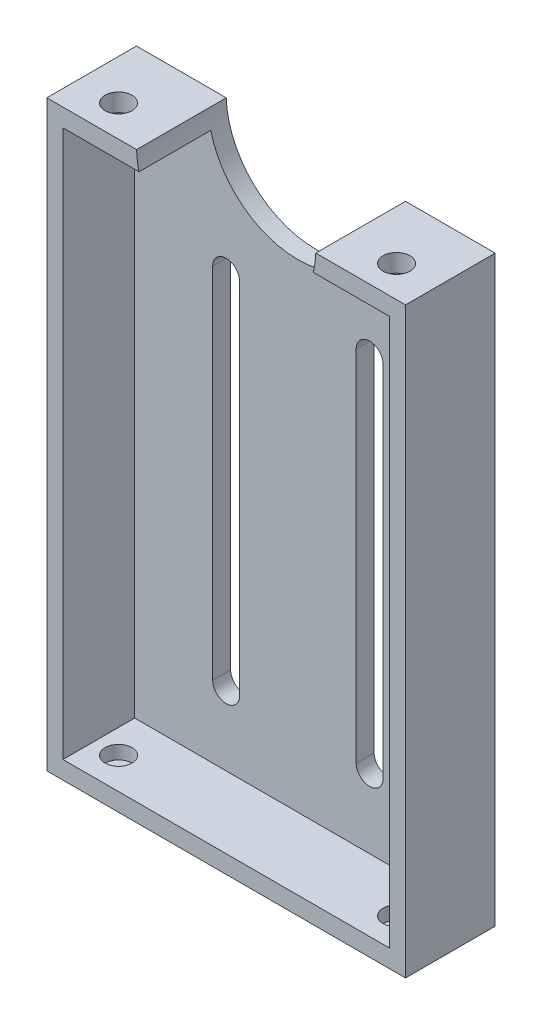
ISO-10303-21;
HEADER;
FILE_DESCRIPTION(('STEP AP214'),'2;1');
FILE_NAME('part.step','',(''),(''),'','','');
FILE_SCHEMA(('AUTOMOTIVE_DESIGN { 1 0 10303 214 1 1 1 1 }'));
ENDSEC;
DATA;
#1=APPLICATION_CONTEXT('core data for automotive mechanical design processes');
#2=APPLICATION_PROTOCOL_DEFINITION('international standard','automotive_design',2000,#1);
#3=PRODUCT_CONTEXT('',#1,'mechanical');
#4=PRODUCT('Part','Part','',(#3));
#5=PRODUCT_RELATED_PRODUCT_CATEGORY('part','',(#4));
#6=PRODUCT_DEFINITION_FORMATION('','',#4);
#7=PRODUCT_DEFINITION_CONTEXT('part definition',#1,'design');
#8=PRODUCT_DEFINITION('design','',#6,#7);
#9=PRODUCT_DEFINITION_SHAPE('','',#8);
#10=(LENGTH_UNIT() NAMED_UNIT(*) SI_UNIT(.MILLI.,.METRE.));
#11=(NAMED_UNIT(*) PLANE_ANGLE_UNIT() SI_UNIT($,.RADIAN.));
#12=(NAMED_UNIT(*) SI_UNIT($,.STERADIAN.) SOLID_ANGLE_UNIT());
#13=UNCERTAINTY_MEASURE_WITH_UNIT(LENGTH_MEASURE(1.E-05),#10,'distance_accuracy_value','');
#14=(GEOMETRIC_REPRESENTATION_CONTEXT(3) GLOBAL_UNCERTAINTY_ASSIGNED_CONTEXT((#13)) GLOBAL_UNIT_ASSIGNED_CONTEXT((#10,
#11,#12)) REPRESENTATION_CONTEXT('',''));
#15=CARTESIAN_POINT('',(0.,0.,0.));
#16=DIRECTION('',(0.,0.,1.));
#17=DIRECTION('',(1.,0.,0.));
#18=AXIS2_PLACEMENT_3D('',#15,#16,#17);
#19=CARTESIAN_POINT('',(0.,32.8692474088532,2.));
#20=DIRECTION('',(0.,0.,1.));
#21=DIRECTION('',(1.,0.,0.));
#22=AXIS2_PLACEMENT_3D('',#19,#20,#21);
#23=PLANE('',#22);
#24=DIRECTION('',(1.,0.,0.));
#25=VECTOR('',#24,1.);
#26=CARTESIAN_POINT('',(-18.2,30.5,2.));
#27=LINE('',#26,#25);
#28=CARTESIAN_POINT('',(-18.2,30.5,2.));
#29=VERTEX_POINT('',#28);
#30=CARTESIAN_POINT('',(-9.71528006367509,30.5,2.));
#31=VERTEX_POINT('',#30);
#32=EDGE_CURVE('E48',#29,#31,#27,.T.);
#33=ORIENTED_EDGE('',*,*,#32,.F.);
#34=DIRECTION('',(0.,1.,0.));
#35=VECTOR('',#34,1.);
#36=CARTESIAN_POINT('',(-18.2,30.5,2.));
#37=LINE('',#36,#35);
#38=CARTESIAN_POINT('',(-18.2,-30.5,2.));
#39=VERTEX_POINT('',#38);
#40=EDGE_CURVE('E52',#39,#29,#37,.T.);
#41=ORIENTED_EDGE('',*,*,#40,.F.);
#42=DIRECTION('',(-1.,0.,0.));
#43=VECTOR('',#42,1.);
#44=CARTESIAN_POINT('',(-18.2,-30.5,2.));
#45=LINE('',#44,#43);
#46=CARTESIAN_POINT('',(18.2,-30.5,2.));
#47=VERTEX_POINT('',#46);
#48=EDGE_CURVE('E225',#47,#39,#45,.T.);
#49=ORIENTED_EDGE('',*,*,#48,.F.);
#50=DIRECTION('',(0.,-1.,0.));
#51=VECTOR('',#50,1.);
#52=CARTESIAN_POINT('',(18.2,30.5,2.));
#53=LINE('',#52,#51);
#54=CARTESIAN_POINT('',(18.2,30.5,2.));
#55=VERTEX_POINT('',#54);
#56=EDGE_CURVE('E221',#55,#47,#53,.T.);
#57=ORIENTED_EDGE('',*,*,#56,.F.);
#58=DIRECTION('',(1.,0.,0.));
#59=VECTOR('',#58,1.);
#60=CARTESIAN_POINT('',(18.2,30.5,2.));
#61=LINE('',#60,#59);
#62=CARTESIAN_POINT('',(9.71528006367509,30.5,2.));
#63=VERTEX_POINT('',#62);
#64=EDGE_CURVE('E218',#63,#55,#61,.T.);
#65=ORIENTED_EDGE('',*,*,#64,.F.);
#66=CARTESIAN_POINT('',(0.,32.8692474088532,2.));
#67=DIRECTION('',(0.,0.,-1.));
#68=DIRECTION('',(1.,0.,0.));
#69=AXIS2_PLACEMENT_3D('',#66,#67,#68);
#70=CIRCLE('',#69,10.);
#71=EDGE_CURVE('E309',#63,#31,#70,.T.);
#72=ORIENTED_EDGE('',*,*,#71,.T.);
#73=EDGE_LOOP('',(#33,#41,#49,#57,#65,#72));
#74=FACE_BOUND('',#73,.T.);
#75=DIRECTION('',(0.,-1.,0.));
#76=VECTOR('',#75,1.);
#77=CARTESIAN_POINT('',(-9.49999999999999,17.5,2.));
#78=LINE('',#77,#76);
#79=CARTESIAN_POINT('',(-9.49999999999999,17.5,2.));
#80=VERTEX_POINT('',#79);
#81=CARTESIAN_POINT('',(-9.49999999999999,-22.5,2.));
#82=VERTEX_POINT('',#81);
#83=EDGE_CURVE('E280',#80,#82,#78,.T.);
#84=ORIENTED_EDGE('',*,*,#83,.F.);
#85=CARTESIAN_POINT('',(-8.00000000000001,17.5,2.));
#86=DIRECTION('',(0.,0.,1.));
#87=DIRECTION('',(1.,0.,0.));
#88=AXIS2_PLACEMENT_3D('',#85,#86,#87);
#89=CIRCLE('',#88,1.49999999999999);
#90=CARTESIAN_POINT('',(-6.50000000000001,17.5,2.));
#91=VERTEX_POINT('',#90);
#92=EDGE_CURVE('E278',#91,#80,#89,.T.);
#93=ORIENTED_EDGE('',*,*,#92,.F.);
#94=DIRECTION('',(0.,1.,0.));
#95=VECTOR('',#94,1.);
#96=CARTESIAN_POINT('',(-6.50000000000001,17.5,2.));
#97=LINE('',#96,#95);
#98=CARTESIAN_POINT('',(-6.49999999999999,-22.5,2.));
#99=VERTEX_POINT('',#98);
#100=EDGE_CURVE('E286',#99,#91,#97,.T.);
#101=ORIENTED_EDGE('',*,*,#100,.F.);
#102=CARTESIAN_POINT('',(-7.99999999999999,-22.5,2.));
#103=DIRECTION('',(0.,0.,1.));
#104=DIRECTION('',(1.,0.,0.));
#105=AXIS2_PLACEMENT_3D('',#102,#103,#104);
#106=CIRCLE('',#105,1.49999999999999);
#107=EDGE_CURVE('E283',#82,#99,#106,.T.);
#108=ORIENTED_EDGE('',*,*,#107,.F.);
#109=EDGE_LOOP('',(#84,#93,#101,#108));
#110=FACE_BOUND('',#109,.T.);
#111=DIRECTION('',(0.,-1.,0.));
#112=VECTOR('',#111,1.);
#113=CARTESIAN_POINT('',(6.50000000000001,17.5,2.));
#114=LINE('',#113,#112);
#115=CARTESIAN_POINT('',(6.50000000000001,17.5,2.));
#116=VERTEX_POINT('',#115);
#117=CARTESIAN_POINT('',(6.50000000000002,-22.5,2.));
#118=VERTEX_POINT('',#117);
#119=EDGE_CURVE('E249',#116,#118,#114,.T.);
#120=ORIENTED_EDGE('',*,*,#119,.F.);
#121=CARTESIAN_POINT('',(8.00000000000001,17.5,2.));
#122=DIRECTION('',(0.,0.,1.));
#123=DIRECTION('',(-1.,0.,0.));
#124=AXIS2_PLACEMENT_3D('',#121,#122,#123);
#125=CIRCLE('',#124,1.49999999999999);
#126=CARTESIAN_POINT('',(9.49999999999998,17.5,2.));
#127=VERTEX_POINT('',#126);
#128=EDGE_CURVE('E247',#127,#116,#125,.T.);
#129=ORIENTED_EDGE('',*,*,#128,.F.);
#130=DIRECTION('',(0.,1.,0.));
#131=VECTOR('',#130,1.);
#132=CARTESIAN_POINT('',(9.49999999999998,17.5,2.));
#133=LINE('',#132,#131);
#134=CARTESIAN_POINT('',(9.49999999999999,-22.5,2.));
#135=VERTEX_POINT('',#134);
#136=EDGE_CURVE('E255',#135,#127,#133,.T.);
#137=ORIENTED_EDGE('',*,*,#136,.F.);
#138=CARTESIAN_POINT('',(8.00000000000002,-22.5,2.));
#139=DIRECTION('',(0.,0.,1.));
#140=DIRECTION('',(-1.,0.,0.));
#141=AXIS2_PLACEMENT_3D('',#138,#139,#140);
#142=CIRCLE('',#141,1.49999999999999);
#143=EDGE_CURVE('E252',#118,#135,#142,.T.);
#144=ORIENTED_EDGE('',*,*,#143,.F.);
#145=EDGE_LOOP('',(#120,#129,#137,#144));
#146=FACE_BOUND('',#145,.T.);
#147=ADVANCED_FACE('F33',(#74,#110,#146),#23,.T.);
#148=CARTESIAN_POINT('',(0.,32.8692474088532,0.));
#149=DIRECTION('',(0.,0.,1.));
#150=DIRECTION('',(1.,0.,0.));
#151=AXIS2_PLACEMENT_3D('',#148,#149,#150);
#152=PLANE('',#151);
#153=CARTESIAN_POINT('',(-8.00000000000001,17.5,0.));
#154=DIRECTION('',(0.,0.,1.));
#155=DIRECTION('',(1.,0.,0.));
#156=AXIS2_PLACEMENT_3D('',#153,#154,#155);
#157=CIRCLE('',#156,1.49999999999999);
#158=CARTESIAN_POINT('',(-6.50000000000001,17.5,0.));
#159=VERTEX_POINT('',#158);
#160=CARTESIAN_POINT('',(-9.49999999999999,17.5,0.));
#161=VERTEX_POINT('',#160);
#162=EDGE_CURVE('E277',#159,#161,#157,.T.);
#163=ORIENTED_EDGE('',*,*,#162,.T.);
#164=DIRECTION('',(0.,-1.,0.));
#165=VECTOR('',#164,1.);
#166=CARTESIAN_POINT('',(-9.49999999999999,17.5,0.));
#167=LINE('',#166,#165);
#168=CARTESIAN_POINT('',(-9.49999999999999,-22.5,0.));
#169=VERTEX_POINT('',#168);
#170=EDGE_CURVE('E291',#161,#169,#167,.T.);
#171=ORIENTED_EDGE('',*,*,#170,.T.);
#172=CARTESIAN_POINT('',(-7.99999999999999,-22.5,0.));
#173=DIRECTION('',(0.,0.,1.));
#174=DIRECTION('',(1.,0.,0.));
#175=AXIS2_PLACEMENT_3D('',#172,#173,#174);
#176=CIRCLE('',#175,1.49999999999999);
#177=CARTESIAN_POINT('',(-6.49999999999999,-22.5,0.));
#178=VERTEX_POINT('',#177);
#179=EDGE_CURVE('E294',#169,#178,#176,.T.);
#180=ORIENTED_EDGE('',*,*,#179,.T.);
#181=DIRECTION('',(0.,1.,0.));
#182=VECTOR('',#181,1.);
#183=CARTESIAN_POINT('',(-6.50000000000001,17.5,0.));
#184=LINE('',#183,#182);
#185=EDGE_CURVE('E281',#178,#159,#184,.T.);
#186=ORIENTED_EDGE('',*,*,#185,.T.);
#187=EDGE_LOOP('',(#163,#171,#180,#186));
#188=FACE_BOUND('',#187,.T.);
#189=DIRECTION('',(0.,1.,0.));
#190=VECTOR('',#189,1.);
#191=CARTESIAN_POINT('',(20.,32.5,0.));
#192=LINE('',#191,#190);
#193=CARTESIAN_POINT('',(20.,-32.5,0.));
#194=VERTEX_POINT('',#193);
#195=CARTESIAN_POINT('',(20.,32.5,0.));
#196=VERTEX_POINT('',#195);
#197=EDGE_CURVE('E308',#194,#196,#192,.T.);
#198=ORIENTED_EDGE('',*,*,#197,.F.);
#199=DIRECTION('',(1.,0.,0.));
#200=VECTOR('',#199,1.);
#201=CARTESIAN_POINT('',(-20.,-32.5,0.));
#202=LINE('',#201,#200);
#203=CARTESIAN_POINT('',(-20.,-32.5,0.));
#204=VERTEX_POINT('',#203);
#205=EDGE_CURVE('E311',#204,#194,#202,.T.);
#206=ORIENTED_EDGE('',*,*,#205,.F.);
#207=DIRECTION('',(0.,-1.,0.));
#208=VECTOR('',#207,1.);
#209=CARTESIAN_POINT('',(-20.,32.5,0.));
#210=LINE('',#209,#208);
#211=CARTESIAN_POINT('',(-20.,32.5,0.));
#212=VERTEX_POINT('',#211);
#213=EDGE_CURVE('E174',#212,#204,#210,.T.);
#214=ORIENTED_EDGE('',*,*,#213,.F.);
#215=DIRECTION('',(-1.,0.,0.));
#216=VECTOR('',#215,1.);
#217=CARTESIAN_POINT('',(-20.,32.5,0.));
#218=LINE('',#217,#216);
#219=CARTESIAN_POINT('',(-9.99318049226848,32.5,0.));
#220=VERTEX_POINT('',#219);
#221=EDGE_CURVE('E318',#220,#212,#218,.T.);
#222=ORIENTED_EDGE('',*,*,#221,.F.);
#223=CARTESIAN_POINT('',(0.,32.8692474088532,0.));
#224=DIRECTION('',(0.,0.,-1.));
#225=DIRECTION('',(1.,0.,0.));
#226=AXIS2_PLACEMENT_3D('',#223,#224,#225);
#227=CIRCLE('',#226,10.);
#228=CARTESIAN_POINT('',(9.99318049226848,32.5,0.));
#229=VERTEX_POINT('',#228);
#230=EDGE_CURVE('E316',#229,#220,#227,.T.);
#231=ORIENTED_EDGE('',*,*,#230,.F.);
#232=DIRECTION('',(-1.,0.,0.));
#233=VECTOR('',#232,1.);
#234=CARTESIAN_POINT('',(9.99318049226848,32.5,0.));
#235=LINE('',#234,#233);
#236=EDGE_CURVE('E314',#196,#229,#235,.T.);
#237=ORIENTED_EDGE('',*,*,#236,.F.);
#238=EDGE_LOOP('',(#198,#206,#214,#222,#231,#237));
#239=FACE_BOUND('',#238,.T.);
#240=CARTESIAN_POINT('',(8.00000000000001,17.5,0.));
#241=DIRECTION('',(0.,0.,1.));
#242=DIRECTION('',(-1.,0.,0.));
#243=AXIS2_PLACEMENT_3D('',#240,#241,#242);
#244=CIRCLE('',#243,1.49999999999999);
#245=CARTESIAN_POINT('',(9.49999999999998,17.5,0.));
#246=VERTEX_POINT('',#245);
#247=CARTESIAN_POINT('',(6.50000000000001,17.5,0.));
#248=VERTEX_POINT('',#247);
#249=EDGE_CURVE('E246',#246,#248,#244,.T.);
#250=ORIENTED_EDGE('',*,*,#249,.T.);
#251=DIRECTION('',(0.,-1.,0.));
#252=VECTOR('',#251,1.);
#253=CARTESIAN_POINT('',(6.50000000000001,17.5,0.));
#254=LINE('',#253,#252);
#255=CARTESIAN_POINT('',(6.50000000000002,-22.5,0.));
#256=VERTEX_POINT('',#255);
#257=EDGE_CURVE('E260',#248,#256,#254,.T.);
#258=ORIENTED_EDGE('',*,*,#257,.T.);
#259=CARTESIAN_POINT('',(8.00000000000002,-22.5,0.));
#260=DIRECTION('',(0.,0.,1.));
#261=DIRECTION('',(-1.,0.,0.));
#262=AXIS2_PLACEMENT_3D('',#259,#260,#261);
#263=CIRCLE('',#262,1.49999999999999);
#264=CARTESIAN_POINT('',(9.50000000000001,-22.5,0.));
#265=VERTEX_POINT('',#264);
#266=EDGE_CURVE('E263',#256,#265,#263,.T.);
#267=ORIENTED_EDGE('',*,*,#266,.T.);
#268=DIRECTION('',(0.,1.,0.));
#269=VECTOR('',#268,1.);
#270=CARTESIAN_POINT('',(9.49999999999998,17.5,0.));
#271=LINE('',#270,#269);
#272=EDGE_CURVE('E250',#265,#246,#271,.T.);
#273=ORIENTED_EDGE('',*,*,#272,.T.);
#274=EDGE_LOOP('',(#250,#258,#267,#273));
#275=FACE_BOUND('',#274,.T.);
#276=ADVANCED_FACE('F337',(#188,#239,#275),#152,.F.);
#277=CARTESIAN_POINT('',(20.,32.5,2.));
#278=DIRECTION('',(-1.,0.,0.));
#279=DIRECTION('',(0.,-1.,0.));
#280=AXIS2_PLACEMENT_3D('',#277,#278,#279);
#281=PLANE('',#280);
#282=ORIENTED_EDGE('',*,*,#197,.T.);
#283=DIRECTION('',(0.,0.,-1.));
#284=VECTOR('',#283,1.);
#285=CARTESIAN_POINT('',(20.,32.5,2.));
#286=LINE('',#285,#284);
#287=CARTESIAN_POINT('',(20.,32.5,10.));
#288=VERTEX_POINT('',#287);
#289=EDGE_CURVE('E11',#288,#196,#286,.T.);
#290=ORIENTED_EDGE('',*,*,#289,.F.);
#291=DIRECTION('',(0.,1.,0.));
#292=VECTOR('',#291,1.);
#293=CARTESIAN_POINT('',(20.,-32.5,10.));
#294=LINE('',#293,#292);
#295=CARTESIAN_POINT('',(20.,-32.5,10.));
#296=VERTEX_POINT('',#295);
#297=EDGE_CURVE('E194',#296,#288,#294,.T.);
#298=ORIENTED_EDGE('',*,*,#297,.F.);
#299=DIRECTION('',(0.,0.,-1.));
#300=VECTOR('',#299,1.);
#301=CARTESIAN_POINT('',(20.,-32.5,2.));
#302=LINE('',#301,#300);
#303=EDGE_CURVE('E179',#296,#194,#302,.T.);
#304=ORIENTED_EDGE('',*,*,#303,.T.);
#305=EDGE_LOOP('',(#282,#290,#298,#304));
#306=FACE_BOUND('',#305,.T.);
#307=ADVANCED_FACE('F35',(#306),#281,.F.);
#308=CARTESIAN_POINT('',(9.99318049226848,32.5,2.));
#309=DIRECTION('',(0.,-1.,0.));
#310=DIRECTION('',(0.,0.,-1.));
#311=AXIS2_PLACEMENT_3D('',#308,#309,#310);
#312=PLANE('',#311);
#313=CARTESIAN_POINT('',(15.5,32.5,6.5));
#314=DIRECTION('',(0.,1.,0.));
#315=DIRECTION('',(0.,0.,-1.));
#316=AXIS2_PLACEMENT_3D('',#313,#314,#315);
#317=CIRCLE('',#316,1.5);
#318=CARTESIAN_POINT('',(15.5,32.5,5.));
#319=VERTEX_POINT('',#318);
#320=EDGE_CURVE('E661',#319,#319,#317,.T.);
#321=ORIENTED_EDGE('',*,*,#320,.F.);
#322=EDGE_LOOP('',(#321));
#323=FACE_BOUND('',#322,.T.);
#324=ORIENTED_EDGE('',*,*,#236,.T.);
#325=DIRECTION('',(0.,0.,-1.));
#326=VECTOR('',#325,1.);
#327=CARTESIAN_POINT('',(9.99318049226848,32.5,2.));
#328=LINE('',#327,#326);
#329=CARTESIAN_POINT('',(9.99318049226848,32.5,10.));
#330=VERTEX_POINT('',#329);
#331=EDGE_CURVE('E41',#330,#229,#328,.T.);
#332=ORIENTED_EDGE('',*,*,#331,.F.);
#333=DIRECTION('',(-1.,0.,0.));
#334=VECTOR('',#333,1.);
#335=CARTESIAN_POINT('',(20.,32.5,10.));
#336=LINE('',#335,#334);
#337=EDGE_CURVE('E196',#288,#330,#336,.T.);
#338=ORIENTED_EDGE('',*,*,#337,.F.);
#339=ORIENTED_EDGE('',*,*,#289,.T.);
#340=EDGE_LOOP('',(#324,#332,#338,#339));
#341=FACE_BOUND('',#340,.T.);
#342=ADVANCED_FACE('F355',(#323,#341),#312,.F.);
#343=CARTESIAN_POINT('',(0.,32.8692474088532,2.));
#344=DIRECTION('',(0.,0.,-1.));
#345=DIRECTION('',(-1.,0.,0.));
#346=AXIS2_PLACEMENT_3D('',#343,#344,#345);
#347=CYLINDRICAL_SURFACE('',#346,10.);
#348=ORIENTED_EDGE('',*,*,#230,.T.);
#349=DIRECTION('',(0.,0.,-1.));
#350=VECTOR('',#349,1.);
#351=CARTESIAN_POINT('',(-9.99318049226848,32.5,2.));
#352=LINE('',#351,#350);
#353=CARTESIAN_POINT('',(-9.99318049226848,32.5,10.));
#354=VERTEX_POINT('',#353);
#355=EDGE_CURVE('E324',#354,#220,#352,.T.);
#356=ORIENTED_EDGE('',*,*,#355,.F.);
#357=CARTESIAN_POINT('',(0.,32.8692474088532,10.));
#358=DIRECTION('',(0.,0.,-1.));
#359=DIRECTION('',(1.,0.,0.));
#360=AXIS2_PLACEMENT_3D('',#357,#358,#359);
#361=CIRCLE('',#360,10.);
#362=CARTESIAN_POINT('',(-9.71528006367509,30.5,10.));
#363=VERTEX_POINT('',#362);
#364=EDGE_CURVE('E214',#363,#354,#361,.T.);
#365=ORIENTED_EDGE('',*,*,#364,.F.);
#366=DIRECTION('',(0.,0.,-1.));
#367=VECTOR('',#366,1.);
#368=CARTESIAN_POINT('',(-9.71528006367509,30.5,10.));
#369=LINE('',#368,#367);
#370=EDGE_CURVE('E217',#363,#31,#369,.T.);
#371=ORIENTED_EDGE('',*,*,#370,.T.);
#372=ORIENTED_EDGE('',*,*,#71,.F.);
#373=DIRECTION('',(0.,0.,-1.));
#374=VECTOR('',#373,1.);
#375=CARTESIAN_POINT('',(9.71528006367509,30.5,10.));
#376=LINE('',#375,#374);
#377=CARTESIAN_POINT('',(9.71528006367509,30.5,10.));
#378=VERTEX_POINT('',#377);
#379=EDGE_CURVE('E243',#378,#63,#376,.T.);
#380=ORIENTED_EDGE('',*,*,#379,.F.);
#381=CARTESIAN_POINT('',(0.,32.8692474088532,10.));
#382=DIRECTION('',(0.,0.,-1.));
#383=DIRECTION('',(-1.,0.,0.));
#384=AXIS2_PLACEMENT_3D('',#381,#382,#383);
#385=CIRCLE('',#384,10.);
#386=EDGE_CURVE('E202',#330,#378,#385,.T.);
#387=ORIENTED_EDGE('',*,*,#386,.F.);
#388=ORIENTED_EDGE('',*,*,#331,.T.);
#389=EDGE_LOOP('',(#348,#356,#365,#371,#372,#380,#387,#388));
#390=FACE_BOUND('',#389,.T.);
#391=ADVANCED_FACE('F330',(#390),#347,.F.);
#392=CARTESIAN_POINT('',(-20.,32.5,2.));
#393=DIRECTION('',(0.,-1.,0.));
#394=DIRECTION('',(0.,0.,-1.));
#395=AXIS2_PLACEMENT_3D('',#392,#393,#394);
#396=PLANE('',#395);
#397=CARTESIAN_POINT('',(-15.5,32.5,6.5));
#398=DIRECTION('',(0.,1.,0.));
#399=DIRECTION('',(0.,0.,1.));
#400=AXIS2_PLACEMENT_3D('',#397,#398,#399);
#401=CIRCLE('',#400,1.5);
#402=CARTESIAN_POINT('',(-15.5,32.5,8.));
#403=VERTEX_POINT('',#402);
#404=EDGE_CURVE('E677',#403,#403,#401,.T.);
#405=ORIENTED_EDGE('',*,*,#404,.F.);
#406=EDGE_LOOP('',(#405));
#407=FACE_BOUND('',#406,.T.);
#408=ORIENTED_EDGE('',*,*,#221,.T.);
#409=DIRECTION('',(0.,0.,-1.));
#410=VECTOR('',#409,1.);
#411=CARTESIAN_POINT('',(-20.,32.5,2.));
#412=LINE('',#411,#410);
#413=CARTESIAN_POINT('',(-20.,32.5,10.));
#414=VERTEX_POINT('',#413);
#415=EDGE_CURVE('E178',#414,#212,#412,.T.);
#416=ORIENTED_EDGE('',*,*,#415,.F.);
#417=DIRECTION('',(-1.,0.,0.));
#418=VECTOR('',#417,1.);
#419=CARTESIAN_POINT('',(-20.,32.5,10.));
#420=LINE('',#419,#418);
#421=EDGE_CURVE('E190',#354,#414,#420,.T.);
#422=ORIENTED_EDGE('',*,*,#421,.F.);
#423=ORIENTED_EDGE('',*,*,#355,.T.);
#424=EDGE_LOOP('',(#408,#416,#422,#423));
#425=FACE_BOUND('',#424,.T.);
#426=ADVANCED_FACE('F340',(#407,#425),#396,.F.);
#427=CARTESIAN_POINT('',(-20.,32.5,2.));
#428=DIRECTION('',(1.,0.,0.));
#429=DIRECTION('',(0.,1.,0.));
#430=AXIS2_PLACEMENT_3D('',#427,#428,#429);
#431=PLANE('',#430);
#432=ORIENTED_EDGE('',*,*,#213,.T.);
#433=DIRECTION('',(0.,0.,-1.));
#434=VECTOR('',#433,1.);
#435=CARTESIAN_POINT('',(-20.,-32.5,2.));
#436=LINE('',#435,#434);
#437=CARTESIAN_POINT('',(-20.,-32.5,10.));
#438=VERTEX_POINT('',#437);
#439=EDGE_CURVE('E168',#438,#204,#436,.T.);
#440=ORIENTED_EDGE('',*,*,#439,.F.);
#441=DIRECTION('',(0.,-1.,0.));
#442=VECTOR('',#441,1.);
#443=CARTESIAN_POINT('',(-20.,32.5,10.));
#444=LINE('',#443,#442);
#445=EDGE_CURVE('E172',#414,#438,#444,.T.);
#446=ORIENTED_EDGE('',*,*,#445,.F.);
#447=ORIENTED_EDGE('',*,*,#415,.T.);
#448=EDGE_LOOP('',(#432,#440,#446,#447));
#449=FACE_BOUND('',#448,.T.);
#450=ADVANCED_FACE('F170',(#449),#431,.F.);
#451=CARTESIAN_POINT('',(-20.,-32.5,2.));
#452=DIRECTION('',(0.,1.,0.));
#453=DIRECTION('',(0.,0.,1.));
#454=AXIS2_PLACEMENT_3D('',#451,#452,#453);
#455=PLANE('',#454);
#456=ORIENTED_EDGE('',*,*,#205,.T.);
#457=ORIENTED_EDGE('',*,*,#303,.F.);
#458=DIRECTION('',(1.,0.,0.));
#459=VECTOR('',#458,1.);
#460=CARTESIAN_POINT('',(-20.,-32.5,10.));
#461=LINE('',#460,#459);
#462=EDGE_CURVE('E186',#438,#296,#461,.T.);
#463=ORIENTED_EDGE('',*,*,#462,.F.);
#464=ORIENTED_EDGE('',*,*,#439,.T.);
#465=EDGE_LOOP('',(#456,#457,#463,#464));
#466=FACE_BOUND('',#465,.T.);
#467=ADVANCED_FACE('F192',(#466),#455,.F.);
#468=CARTESIAN_POINT('',(-8.00000000000001,17.5,2.));
#469=DIRECTION('',(0.,0.,-1.));
#470=DIRECTION('',(-1.,0.,0.));
#471=AXIS2_PLACEMENT_3D('',#468,#469,#470);
#472=CYLINDRICAL_SURFACE('',#471,1.49999999999999);
#473=ORIENTED_EDGE('',*,*,#162,.F.);
#474=DIRECTION('',(0.,0.,-1.));
#475=VECTOR('',#474,1.);
#476=CARTESIAN_POINT('',(-6.50000000000001,17.5,2.));
#477=LINE('',#476,#475);
#478=EDGE_CURVE('E288',#91,#159,#477,.T.);
#479=ORIENTED_EDGE('',*,*,#478,.F.);
#480=ORIENTED_EDGE('',*,*,#92,.T.);
#481=DIRECTION('',(0.,0.,-1.));
#482=VECTOR('',#481,1.);
#483=CARTESIAN_POINT('',(-9.49999999999999,17.5,2.));
#484=LINE('',#483,#482);
#485=EDGE_CURVE('E305',#80,#161,#484,.T.);
#486=ORIENTED_EDGE('',*,*,#485,.T.);
#487=EDGE_LOOP('',(#473,#479,#480,#486));
#488=FACE_BOUND('',#487,.T.);
#489=ADVANCED_FACE('F371',(#488),#472,.F.);
#490=CARTESIAN_POINT('',(-9.49999999999999,17.5,2.));
#491=DIRECTION('',(1.,0.,0.));
#492=DIRECTION('',(0.,1.,0.));
#493=AXIS2_PLACEMENT_3D('',#490,#491,#492);
#494=PLANE('',#493);
#495=ORIENTED_EDGE('',*,*,#170,.F.);
#496=ORIENTED_EDGE('',*,*,#485,.F.);
#497=ORIENTED_EDGE('',*,*,#83,.T.);
#498=DIRECTION('',(0.,0.,-1.));
#499=VECTOR('',#498,1.);
#500=CARTESIAN_POINT('',(-9.49999999999999,-22.5,2.));
#501=LINE('',#500,#499);
#502=EDGE_CURVE('E303',#82,#169,#501,.T.);
#503=ORIENTED_EDGE('',*,*,#502,.T.);
#504=EDGE_LOOP('',(#495,#496,#497,#503));
#505=FACE_BOUND('',#504,.T.);
#506=ADVANCED_FACE('F406',(#505),#494,.T.);
#507=CARTESIAN_POINT('',(-7.99999999999999,-22.5,2.));
#508=DIRECTION('',(0.,0.,-1.));
#509=DIRECTION('',(-1.,0.,0.));
#510=AXIS2_PLACEMENT_3D('',#507,#508,#509);
#511=CYLINDRICAL_SURFACE('',#510,1.49999999999999);
#512=ORIENTED_EDGE('',*,*,#179,.F.);
#513=ORIENTED_EDGE('',*,*,#502,.F.);
#514=ORIENTED_EDGE('',*,*,#107,.T.);
#515=DIRECTION('',(0.,0.,-1.));
#516=VECTOR('',#515,1.);
#517=CARTESIAN_POINT('',(-6.49999999999999,-22.5,2.));
#518=LINE('',#517,#516);
#519=EDGE_CURVE('E301',#99,#178,#518,.T.);
#520=ORIENTED_EDGE('',*,*,#519,.T.);
#521=EDGE_LOOP('',(#512,#513,#514,#520));
#522=FACE_BOUND('',#521,.T.);
#523=ADVANCED_FACE('F414',(#522),#511,.F.);
#524=CARTESIAN_POINT('',(-6.50000000000001,17.5,2.));
#525=DIRECTION('',(-1.,0.,0.));
#526=DIRECTION('',(0.,-1.,0.));
#527=AXIS2_PLACEMENT_3D('',#524,#525,#526);
#528=PLANE('',#527);
#529=ORIENTED_EDGE('',*,*,#185,.F.);
#530=ORIENTED_EDGE('',*,*,#519,.F.);
#531=ORIENTED_EDGE('',*,*,#100,.T.);
#532=ORIENTED_EDGE('',*,*,#478,.T.);
#533=EDGE_LOOP('',(#529,#530,#531,#532));
#534=FACE_BOUND('',#533,.T.);
#535=ADVANCED_FACE('F421',(#534),#528,.T.);
#536=CARTESIAN_POINT('',(8.00000000000001,17.5,2.));
#537=DIRECTION('',(0.,0.,-1.));
#538=DIRECTION('',(-1.,0.,0.));
#539=AXIS2_PLACEMENT_3D('',#536,#537,#538);
#540=CYLINDRICAL_SURFACE('',#539,1.49999999999999);
#541=ORIENTED_EDGE('',*,*,#249,.F.);
#542=DIRECTION('',(0.,0.,-1.));
#543=VECTOR('',#542,1.);
#544=CARTESIAN_POINT('',(9.49999999999998,17.5,2.));
#545=LINE('',#544,#543);
#546=EDGE_CURVE('E257',#127,#246,#545,.T.);
#547=ORIENTED_EDGE('',*,*,#546,.F.);
#548=ORIENTED_EDGE('',*,*,#128,.T.);
#549=DIRECTION('',(0.,0.,-1.));
#550=VECTOR('',#549,1.);
#551=CARTESIAN_POINT('',(6.50000000000001,17.5,2.));
#552=LINE('',#551,#550);
#553=EDGE_CURVE('E274',#116,#248,#552,.T.);
#554=ORIENTED_EDGE('',*,*,#553,.T.);
#555=EDGE_LOOP('',(#541,#547,#548,#554));
#556=FACE_BOUND('',#555,.T.);
#557=ADVANCED_FACE('F429',(#556),#540,.F.);
#558=CARTESIAN_POINT('',(6.50000000000001,17.5,2.));
#559=DIRECTION('',(1.,0.,0.));
#560=DIRECTION('',(0.,1.,0.));
#561=AXIS2_PLACEMENT_3D('',#558,#559,#560);
#562=PLANE('',#561);
#563=ORIENTED_EDGE('',*,*,#257,.F.);
#564=ORIENTED_EDGE('',*,*,#553,.F.);
#565=ORIENTED_EDGE('',*,*,#119,.T.);
#566=DIRECTION('',(0.,0.,-1.));
#567=VECTOR('',#566,1.);
#568=CARTESIAN_POINT('',(6.50000000000002,-22.5,2.));
#569=LINE('',#568,#567);
#570=EDGE_CURVE('E272',#118,#256,#569,.T.);
#571=ORIENTED_EDGE('',*,*,#570,.T.);
#572=EDGE_LOOP('',(#563,#564,#565,#571));
#573=FACE_BOUND('',#572,.T.);
#574=ADVANCED_FACE('F437',(#573),#562,.T.);
#575=CARTESIAN_POINT('',(8.00000000000002,-22.5,2.));
#576=DIRECTION('',(0.,0.,-1.));
#577=DIRECTION('',(-1.,0.,0.));
#578=AXIS2_PLACEMENT_3D('',#575,#576,#577);
#579=CYLINDRICAL_SURFACE('',#578,1.49999999999999);
#580=ORIENTED_EDGE('',*,*,#266,.F.);
#581=ORIENTED_EDGE('',*,*,#570,.F.);
#582=ORIENTED_EDGE('',*,*,#143,.T.);
#583=DIRECTION('',(0.,0.,-1.));
#584=VECTOR('',#583,1.);
#585=CARTESIAN_POINT('',(9.50000000000001,-22.5,2.));
#586=LINE('',#585,#584);
#587=EDGE_CURVE('E270',#135,#265,#586,.T.);
#588=ORIENTED_EDGE('',*,*,#587,.T.);
#589=EDGE_LOOP('',(#580,#581,#582,#588));
#590=FACE_BOUND('',#589,.T.);
#591=ADVANCED_FACE('F445',(#590),#579,.F.);
#592=CARTESIAN_POINT('',(9.49999999999998,17.5,2.));
#593=DIRECTION('',(-1.,0.,0.));
#594=DIRECTION('',(0.,-1.,0.));
#595=AXIS2_PLACEMENT_3D('',#592,#593,#594);
#596=PLANE('',#595);
#597=ORIENTED_EDGE('',*,*,#272,.F.);
#598=ORIENTED_EDGE('',*,*,#587,.F.);
#599=ORIENTED_EDGE('',*,*,#136,.T.);
#600=ORIENTED_EDGE('',*,*,#546,.T.);
#601=EDGE_LOOP('',(#597,#598,#599,#600));
#602=FACE_BOUND('',#601,.T.);
#603=ADVANCED_FACE('F453',(#602),#596,.T.);
#604=CARTESIAN_POINT('',(18.2,30.5,10.));
#605=DIRECTION('',(0.,1.,0.));
#606=DIRECTION('',(0.,0.,1.));
#607=AXIS2_PLACEMENT_3D('',#604,#605,#606);
#608=PLANE('',#607);
#609=CARTESIAN_POINT('',(15.5,30.5,6.5));
#610=DIRECTION('',(0.,1.,0.));
#611=DIRECTION('',(0.,0.,-1.));
#612=AXIS2_PLACEMENT_3D('',#609,#610,#611);
#613=CIRCLE('',#612,1.5);
#614=CARTESIAN_POINT('',(15.5,30.5,5.));
#615=VERTEX_POINT('',#614);
#616=EDGE_CURVE('E665',#615,#615,#613,.T.);
#617=ORIENTED_EDGE('',*,*,#616,.T.);
#618=EDGE_LOOP('',(#617));
#619=FACE_BOUND('',#618,.T.);
#620=ORIENTED_EDGE('',*,*,#64,.T.);
#621=DIRECTION('',(0.,0.,-1.));
#622=VECTOR('',#621,1.);
#623=CARTESIAN_POINT('',(18.2,30.5,10.));
#624=LINE('',#623,#622);
#625=CARTESIAN_POINT('',(18.2,30.5,10.));
#626=VERTEX_POINT('',#625);
#627=EDGE_CURVE('E240',#626,#55,#624,.T.);
#628=ORIENTED_EDGE('',*,*,#627,.F.);
#629=DIRECTION('',(1.,0.,0.));
#630=VECTOR('',#629,1.);
#631=CARTESIAN_POINT('',(18.2,30.5,10.));
#632=LINE('',#631,#630);
#633=EDGE_CURVE('E204',#378,#626,#632,.T.);
#634=ORIENTED_EDGE('',*,*,#633,.F.);
#635=ORIENTED_EDGE('',*,*,#379,.T.);
#636=EDGE_LOOP('',(#620,#628,#634,#635));
#637=FACE_BOUND('',#636,.T.);
#638=ADVANCED_FACE('F351',(#619,#637),#608,.F.);
#639=CARTESIAN_POINT('',(18.2,30.5,10.));
#640=DIRECTION('',(1.,0.,0.));
#641=DIRECTION('',(0.,1.,0.));
#642=AXIS2_PLACEMENT_3D('',#639,#640,#641);
#643=PLANE('',#642);
#644=ORIENTED_EDGE('',*,*,#56,.T.);
#645=DIRECTION('',(0.,0.,-1.));
#646=VECTOR('',#645,1.);
#647=CARTESIAN_POINT('',(18.2,-30.5,10.));
#648=LINE('',#647,#646);
#649=CARTESIAN_POINT('',(18.2,-30.5,10.));
#650=VERTEX_POINT('',#649);
#651=EDGE_CURVE('E237',#650,#47,#648,.T.);
#652=ORIENTED_EDGE('',*,*,#651,.F.);
#653=DIRECTION('',(0.,-1.,0.));
#654=VECTOR('',#653,1.);
#655=CARTESIAN_POINT('',(18.2,30.5,10.));
#656=LINE('',#655,#654);
#657=EDGE_CURVE('E206',#626,#650,#656,.T.);
#658=ORIENTED_EDGE('',*,*,#657,.F.);
#659=ORIENTED_EDGE('',*,*,#627,.T.);
#660=EDGE_LOOP('',(#644,#652,#658,#659));
#661=FACE_BOUND('',#660,.T.);
#662=ADVANCED_FACE('F467',(#661),#643,.F.);
#663=CARTESIAN_POINT('',(-18.2,-30.5,10.));
#664=DIRECTION('',(0.,-1.,0.));
#665=DIRECTION('',(1.,0.,0.));
#666=AXIS2_PLACEMENT_3D('',#663,#664,#665);
#667=PLANE('',#666);
#668=CARTESIAN_POINT('',(-15.5,-30.5,6.5));
#669=DIRECTION('',(0.,1.,0.));
#670=DIRECTION('',(-1.,0.,0.));
#671=AXIS2_PLACEMENT_3D('',#668,#669,#670);
#672=CIRCLE('',#671,1.5);
#673=CARTESIAN_POINT('',(-17.,-30.5,6.5));
#674=VERTEX_POINT('',#673);
#675=EDGE_CURVE('E662',#674,#674,#672,.T.);
#676=ORIENTED_EDGE('',*,*,#675,.F.);
#677=EDGE_LOOP('',(#676));
#678=FACE_BOUND('',#677,.T.);
#679=CARTESIAN_POINT('',(15.5,-30.5,6.5));
#680=DIRECTION('',(0.,1.,0.));
#681=DIRECTION('',(1.,0.,0.));
#682=AXIS2_PLACEMENT_3D('',#679,#680,#681);
#683=CIRCLE('',#682,1.5);
#684=CARTESIAN_POINT('',(17.,-30.5,6.5));
#685=VERTEX_POINT('',#684);
#686=EDGE_CURVE('E672',#685,#685,#683,.T.);
#687=ORIENTED_EDGE('',*,*,#686,.F.);
#688=EDGE_LOOP('',(#687));
#689=FACE_BOUND('',#688,.T.);
#690=ORIENTED_EDGE('',*,*,#48,.T.);
#691=DIRECTION('',(0.,0.,-1.));
#692=VECTOR('',#691,1.);
#693=CARTESIAN_POINT('',(-18.2,-30.5,10.));
#694=LINE('',#693,#692);
#695=CARTESIAN_POINT('',(-18.2,-30.5,10.));
#696=VERTEX_POINT('',#695);
#697=EDGE_CURVE('E234',#696,#39,#694,.T.);
#698=ORIENTED_EDGE('',*,*,#697,.F.);
#699=DIRECTION('',(-1.,0.,0.));
#700=VECTOR('',#699,1.);
#701=CARTESIAN_POINT('',(-18.2,-30.5,10.));
#702=LINE('',#701,#700);
#703=EDGE_CURVE('E208',#650,#696,#702,.T.);
#704=ORIENTED_EDGE('',*,*,#703,.F.);
#705=ORIENTED_EDGE('',*,*,#651,.T.);
#706=EDGE_LOOP('',(#690,#698,#704,#705));
#707=FACE_BOUND('',#706,.T.);
#708=ADVANCED_FACE('F475',(#678,#689,#707),#667,.F.);
#709=CARTESIAN_POINT('',(-18.2,30.5,10.));
#710=DIRECTION('',(-1.,0.,0.));
#711=DIRECTION('',(0.,-1.,0.));
#712=AXIS2_PLACEMENT_3D('',#709,#710,#711);
#713=PLANE('',#712);
#714=ORIENTED_EDGE('',*,*,#40,.T.);
#715=DIRECTION('',(0.,0.,-1.));
#716=VECTOR('',#715,1.);
#717=CARTESIAN_POINT('',(-18.2,30.5,10.));
#718=LINE('',#717,#716);
#719=CARTESIAN_POINT('',(-18.2,30.5,10.));
#720=VERTEX_POINT('',#719);
#721=EDGE_CURVE('E231',#720,#29,#718,.T.);
#722=ORIENTED_EDGE('',*,*,#721,.F.);
#723=DIRECTION('',(0.,1.,0.));
#724=VECTOR('',#723,1.);
#725=CARTESIAN_POINT('',(-18.2,30.5,10.));
#726=LINE('',#725,#724);
#727=EDGE_CURVE('E210',#696,#720,#726,.T.);
#728=ORIENTED_EDGE('',*,*,#727,.F.);
#729=ORIENTED_EDGE('',*,*,#697,.T.);
#730=EDGE_LOOP('',(#714,#722,#728,#729));
#731=FACE_BOUND('',#730,.T.);
#732=ADVANCED_FACE('F484',(#731),#713,.F.);
#733=CARTESIAN_POINT('',(-18.2,30.5,10.));
#734=DIRECTION('',(0.,1.,0.));
#735=DIRECTION('',(0.,0.,1.));
#736=AXIS2_PLACEMENT_3D('',#733,#734,#735);
#737=PLANE('',#736);
#738=CARTESIAN_POINT('',(-15.5,30.5,6.5));
#739=DIRECTION('',(0.,1.,0.));
#740=DIRECTION('',(0.,0.,1.));
#741=AXIS2_PLACEMENT_3D('',#738,#739,#740);
#742=CIRCLE('',#741,1.5);
#743=CARTESIAN_POINT('',(-15.5,30.5,8.));
#744=VERTEX_POINT('',#743);
#745=EDGE_CURVE('E222',#744,#744,#742,.T.);
#746=ORIENTED_EDGE('',*,*,#745,.T.);
#747=EDGE_LOOP('',(#746));
#748=FACE_BOUND('',#747,.T.);
#749=ORIENTED_EDGE('',*,*,#32,.T.);
#750=ORIENTED_EDGE('',*,*,#370,.F.);
#751=DIRECTION('',(1.,0.,0.));
#752=VECTOR('',#751,1.);
#753=CARTESIAN_POINT('',(-18.2,30.5,10.));
#754=LINE('',#753,#752);
#755=EDGE_CURVE('E212',#720,#363,#754,.T.);
#756=ORIENTED_EDGE('',*,*,#755,.F.);
#757=ORIENTED_EDGE('',*,*,#721,.T.);
#758=EDGE_LOOP('',(#749,#750,#756,#757));
#759=FACE_BOUND('',#758,.T.);
#760=ADVANCED_FACE('F347',(#748,#759),#737,.F.);
#761=CARTESIAN_POINT('',(0.,32.8692474088532,10.));
#762=DIRECTION('',(0.,0.,-1.));
#763=DIRECTION('',(-1.,0.,0.));
#764=AXIS2_PLACEMENT_3D('',#761,#762,#763);
#765=PLANE('',#764);
#766=ORIENTED_EDGE('',*,*,#445,.T.);
#767=ORIENTED_EDGE('',*,*,#462,.T.);
#768=ORIENTED_EDGE('',*,*,#297,.T.);
#769=ORIENTED_EDGE('',*,*,#337,.T.);
#770=ORIENTED_EDGE('',*,*,#386,.T.);
#771=ORIENTED_EDGE('',*,*,#633,.T.);
#772=ORIENTED_EDGE('',*,*,#657,.T.);
#773=ORIENTED_EDGE('',*,*,#703,.T.);
#774=ORIENTED_EDGE('',*,*,#727,.T.);
#775=ORIENTED_EDGE('',*,*,#755,.T.);
#776=ORIENTED_EDGE('',*,*,#364,.T.);
#777=ORIENTED_EDGE('',*,*,#421,.T.);
#778=EDGE_LOOP('',(#766,#767,#768,#769,#770,#771,#772,#773,#774,#775,#776,#777));
#779=FACE_BOUND('',#778,.T.);
#780=ADVANCED_FACE('F184',(#779),#765,.F.);
#781=CARTESIAN_POINT('',(-15.5,30.5,6.5));
#782=DIRECTION('',(0.,1.,0.));
#783=DIRECTION('',(0.,0.,1.));
#784=AXIS2_PLACEMENT_3D('',#781,#782,#783);
#785=CYLINDRICAL_SURFACE('',#784,1.5);
#786=ORIENTED_EDGE('',*,*,#745,.F.);
#787=EDGE_LOOP('',(#786));
#788=FACE_BOUND('',#787,.T.);
#789=ORIENTED_EDGE('',*,*,#404,.T.);
#790=EDGE_LOOP('',(#789));
#791=FACE_BOUND('',#790,.T.);
#792=ADVANCED_FACE('F507',(#788,#791),#785,.F.);
#793=CARTESIAN_POINT('',(15.5,30.5,6.5));
#794=DIRECTION('',(0.,1.,0.));
#795=DIRECTION('',(0.,0.,1.));
#796=AXIS2_PLACEMENT_3D('',#793,#794,#795);
#797=CYLINDRICAL_SURFACE('',#796,1.5);
#798=ORIENTED_EDGE('',*,*,#616,.F.);
#799=EDGE_LOOP('',(#798));
#800=FACE_BOUND('',#799,.T.);
#801=ORIENTED_EDGE('',*,*,#320,.T.);
#802=EDGE_LOOP('',(#801));
#803=FACE_BOUND('',#802,.T.);
#804=ADVANCED_FACE('F513',(#800,#803),#797,.F.);
#805=CARTESIAN_POINT('',(15.5,-32.,6.5));
#806=DIRECTION('',(0.,1.,0.));
#807=DIRECTION('',(-1.,0.,0.));
#808=AXIS2_PLACEMENT_3D('',#805,#806,#807);
#809=CYLINDRICAL_SURFACE('',#808,1.5);
#810=CARTESIAN_POINT('',(15.5,-32.,6.5));
#811=DIRECTION('',(0.,1.,0.));
#812=DIRECTION('',(1.,0.,0.));
#813=AXIS2_PLACEMENT_3D('',#810,#811,#812);
#814=CIRCLE('',#813,1.5);
#815=CARTESIAN_POINT('',(17.,-32.,6.5));
#816=VERTEX_POINT('',#815);
#817=EDGE_CURVE('E667',#816,#816,#814,.T.);
#818=ORIENTED_EDGE('',*,*,#817,.F.);
#819=EDGE_LOOP('',(#818));
#820=FACE_BOUND('',#819,.T.);
#821=ORIENTED_EDGE('',*,*,#686,.T.);
#822=EDGE_LOOP('',(#821));
#823=FACE_BOUND('',#822,.T.);
#824=ADVANCED_FACE('F520',(#820,#823),#809,.F.);
#825=CARTESIAN_POINT('',(15.5,-32.,6.5));
#826=DIRECTION('',(0.,-1.,0.));
#827=DIRECTION('',(1.,0.,0.));
#828=AXIS2_PLACEMENT_3D('',#825,#826,#827);
#829=PLANE('',#828);
#830=ORIENTED_EDGE('',*,*,#817,.T.);
#831=EDGE_LOOP('',(#830));
#832=FACE_BOUND('',#831,.T.);
#833=ADVANCED_FACE('F527',(#832),#829,.F.);
#834=CARTESIAN_POINT('',(-15.5,-32.,6.5));
#835=DIRECTION('',(0.,1.,0.));
#836=DIRECTION('',(-1.,0.,0.));
#837=AXIS2_PLACEMENT_3D('',#834,#835,#836);
#838=CYLINDRICAL_SURFACE('',#837,1.5);
#839=CARTESIAN_POINT('',(-15.5,-32.,6.5));
#840=DIRECTION('',(0.,1.,0.));
#841=DIRECTION('',(-1.,0.,0.));
#842=AXIS2_PLACEMENT_3D('',#839,#840,#841);
#843=CIRCLE('',#842,1.5);
#844=CARTESIAN_POINT('',(-17.,-32.,6.5));
#845=VERTEX_POINT('',#844);
#846=EDGE_CURVE('E660',#845,#845,#843,.T.);
#847=ORIENTED_EDGE('',*,*,#846,.F.);
#848=EDGE_LOOP('',(#847));
#849=FACE_BOUND('',#848,.T.);
#850=ORIENTED_EDGE('',*,*,#675,.T.);
#851=EDGE_LOOP('',(#850));
#852=FACE_BOUND('',#851,.T.);
#853=ADVANCED_FACE('F535',(#849,#852),#838,.F.);
#854=CARTESIAN_POINT('',(-15.5,-32.,6.5));
#855=DIRECTION('',(0.,1.,0.));
#856=DIRECTION('',(-1.,0.,0.));
#857=AXIS2_PLACEMENT_3D('',#854,#855,#856);
#858=PLANE('',#857);
#859=ORIENTED_EDGE('',*,*,#846,.T.);
#860=EDGE_LOOP('',(#859));
#861=FACE_BOUND('',#860,.T.);
#862=ADVANCED_FACE('F543',(#861),#858,.T.);
#863=CLOSED_SHELL('',(#147,#276,#307,#342,#391,#426,#450,#467,#489,#506,#523,#535,#557,#574,
#591,#603,#638,#662,#708,#732,#760,#780,#792,#804,#824,#833,#853,#862));
#864=MANIFOLD_SOLID_BREP('B2',#863);
#865=ADVANCED_BREP_SHAPE_REPRESENTATION('',(#18,#864),#14);
#866=SHAPE_DEFINITION_REPRESENTATION(#9,#865);
ENDSEC;
END-ISO-10303-21;
